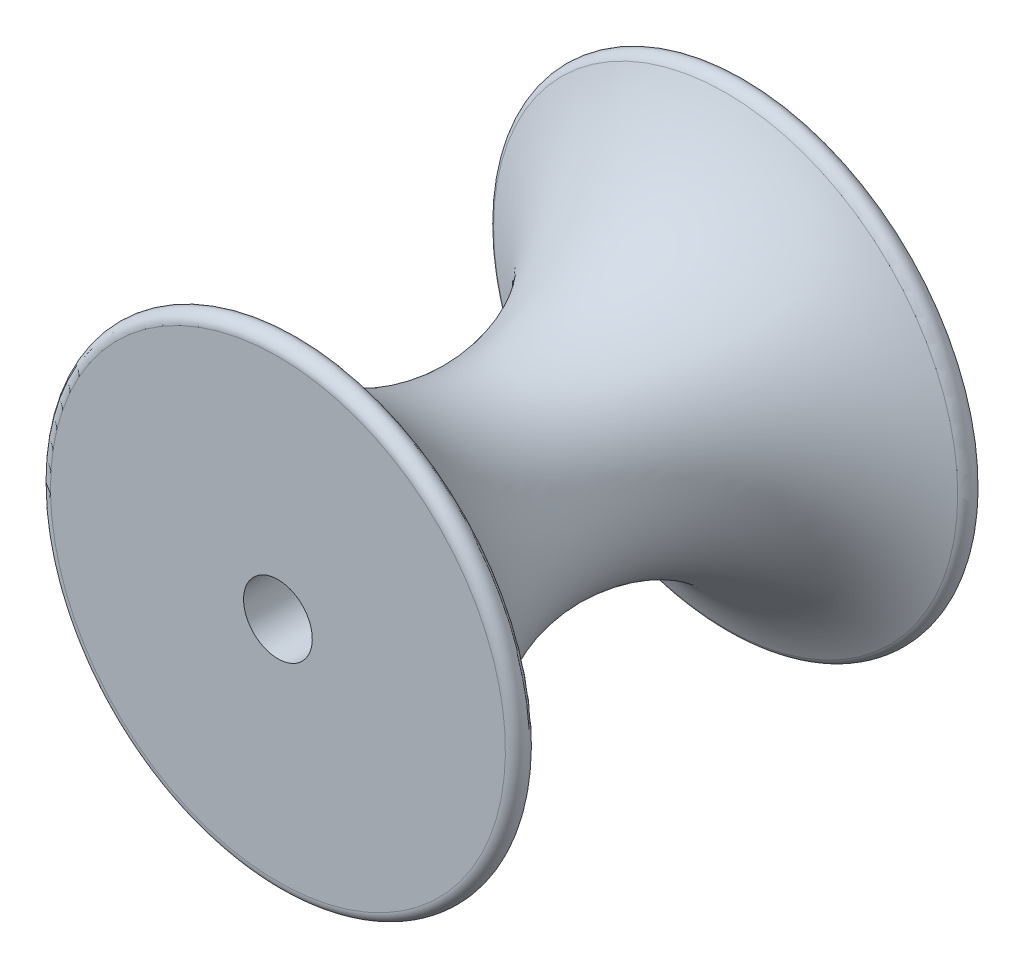
ISO-10303-21;
HEADER;
FILE_DESCRIPTION(('STEP AP214'),'2;1');
FILE_NAME('part.step','',(''),(''),'','','');
FILE_SCHEMA(('AUTOMOTIVE_DESIGN { 1 0 10303 214 1 1 1 1 }'));
ENDSEC;
DATA;
#1=APPLICATION_CONTEXT('core data for automotive mechanical design processes');
#2=APPLICATION_PROTOCOL_DEFINITION('international standard','automotive_design',2000,#1);
#3=PRODUCT_CONTEXT('',#1,'mechanical');
#4=PRODUCT('Part','Part','',(#3));
#5=PRODUCT_RELATED_PRODUCT_CATEGORY('part','',(#4));
#6=PRODUCT_DEFINITION_FORMATION('','',#4);
#7=PRODUCT_DEFINITION_CONTEXT('part definition',#1,'design');
#8=PRODUCT_DEFINITION('design','',#6,#7);
#9=PRODUCT_DEFINITION_SHAPE('','',#8);
#10=(LENGTH_UNIT() NAMED_UNIT(*) SI_UNIT(.MILLI.,.METRE.));
#11=(NAMED_UNIT(*) PLANE_ANGLE_UNIT() SI_UNIT($,.RADIAN.));
#12=(NAMED_UNIT(*) SI_UNIT($,.STERADIAN.) SOLID_ANGLE_UNIT());
#13=UNCERTAINTY_MEASURE_WITH_UNIT(LENGTH_MEASURE(1.E-05),#10,'distance_accuracy_value','');
#14=(GEOMETRIC_REPRESENTATION_CONTEXT(3) GLOBAL_UNCERTAINTY_ASSIGNED_CONTEXT((#13)) GLOBAL_UNIT_ASSIGNED_CONTEXT((#10,
#11,#12)) REPRESENTATION_CONTEXT('',''));
#15=CARTESIAN_POINT('',(0.,0.,0.));
#16=DIRECTION('',(0.,0.,1.));
#17=DIRECTION('',(1.,0.,0.));
#18=AXIS2_PLACEMENT_3D('',#15,#16,#17);
#19=CARTESIAN_POINT('',(0.,0.,-10.9));
#20=DIRECTION('',(0.,0.,-1.));
#21=DIRECTION('',(0.,1.,0.));
#22=AXIS2_PLACEMENT_3D('',#19,#20,#21);
#23=PLANE('',#22);
#24=CARTESIAN_POINT('',(0.,0.,-10.9));
#25=DIRECTION('',(0.,0.,-1.));
#26=DIRECTION('',(0.,1.,0.));
#27=AXIS2_PLACEMENT_3D('',#24,#25,#26);
#28=CIRCLE('',#27,10.5918435232768);
#29=CARTESIAN_POINT('',(0.,10.5918435232768,-10.9));
#30=VERTEX_POINT('',#29);
#31=EDGE_CURVE('E10',#30,#30,#28,.T.);
#32=ORIENTED_EDGE('',*,*,#31,.T.);
#33=EDGE_LOOP('',(#32));
#34=FACE_BOUND('',#33,.T.);
#35=CARTESIAN_POINT('',(0.,0.,-10.9));
#36=DIRECTION('',(0.,0.,-1.));
#37=DIRECTION('',(0.,1.,0.));
#38=AXIS2_PLACEMENT_3D('',#35,#36,#37);
#39=CIRCLE('',#38,1.60000000000001);
#40=CARTESIAN_POINT('',(0.,1.60000000000001,-10.9));
#41=VERTEX_POINT('',#40);
#42=EDGE_CURVE('E62',#41,#41,#39,.T.);
#43=ORIENTED_EDGE('',*,*,#42,.F.);
#44=EDGE_LOOP('',(#43));
#45=FACE_BOUND('',#44,.T.);
#46=ADVANCED_FACE('F39',(#34,#45),#23,.T.);
#47=CARTESIAN_POINT('',(0.,0.,0.));
#48=DIRECTION('',(0.,0.,-1.));
#49=DIRECTION('',(0.,1.,0.));
#50=AXIS2_PLACEMENT_3D('',#47,#48,#49);
#51=TOROIDAL_SURFACE('',#50,15.5,11.);
#52=CARTESIAN_POINT('',(0.,0.,9.94782608695652));
#53=DIRECTION('',(0.,0.,-1.));
#54=DIRECTION('',(0.,1.,0.));
#55=AXIS2_PLACEMENT_3D('',#52,#53,#54);
#56=CIRCLE('',#55,10.8052416309604);
#57=CARTESIAN_POINT('',(0.,10.8052416309604,9.94782608695652));
#58=VERTEX_POINT('',#57);
#59=EDGE_CURVE('E50',#58,#58,#56,.T.);
#60=ORIENTED_EDGE('',*,*,#59,.T.);
#61=EDGE_LOOP('',(#60));
#62=FACE_BOUND('',#61,.T.);
#63=CARTESIAN_POINT('',(0.,0.,-9.94782608695651));
#64=DIRECTION('',(0.,0.,1.));
#65=DIRECTION('',(0.,-1.,0.));
#66=AXIS2_PLACEMENT_3D('',#63,#64,#65);
#67=CIRCLE('',#66,10.8052416309604);
#68=CARTESIAN_POINT('',(0.,-10.8052416309604,-9.94782608695652));
#69=VERTEX_POINT('',#68);
#70=EDGE_CURVE('E54',#69,#69,#67,.T.);
#71=ORIENTED_EDGE('',*,*,#70,.T.);
#72=EDGE_LOOP('',(#71));
#73=FACE_BOUND('',#72,.T.);
#74=ADVANCED_FACE('F69',(#62,#73),#51,.F.);
#75=CARTESIAN_POINT('',(0.,0.,10.9));
#76=DIRECTION('',(0.,0.,-1.));
#77=DIRECTION('',(0.,1.,0.));
#78=AXIS2_PLACEMENT_3D('',#75,#76,#77);
#79=PLANE('',#78);
#80=CARTESIAN_POINT('',(0.,0.,10.9));
#81=DIRECTION('',(0.,0.,-1.));
#82=DIRECTION('',(0.,1.,0.));
#83=AXIS2_PLACEMENT_3D('',#80,#81,#82);
#84=CIRCLE('',#83,10.5918435232768);
#85=CARTESIAN_POINT('',(0.,10.5918435232768,10.9));
#86=VERTEX_POINT('',#85);
#87=EDGE_CURVE('E46',#86,#86,#84,.F.);
#88=ORIENTED_EDGE('',*,*,#87,.T.);
#89=EDGE_LOOP('',(#88));
#90=FACE_BOUND('',#89,.T.);
#91=CARTESIAN_POINT('',(0.,0.,10.9));
#92=DIRECTION('',(0.,0.,-1.));
#93=DIRECTION('',(0.,1.,0.));
#94=AXIS2_PLACEMENT_3D('',#91,#92,#93);
#95=CIRCLE('',#94,1.60000000000001);
#96=CARTESIAN_POINT('',(0.,1.6,10.9));
#97=VERTEX_POINT('',#96);
#98=EDGE_CURVE('E59',#97,#97,#95,.T.);
#99=ORIENTED_EDGE('',*,*,#98,.T.);
#100=EDGE_LOOP('',(#99));
#101=FACE_BOUND('',#100,.T.);
#102=ADVANCED_FACE('F75',(#90,#101),#79,.F.);
#103=CARTESIAN_POINT('',(0.,0.,-11.));
#104=DIRECTION('',(0.,0.,-1.));
#105=DIRECTION('',(0.,1.,0.));
#106=AXIS2_PLACEMENT_3D('',#103,#104,#105);
#107=CYLINDRICAL_SURFACE('',#106,1.60000000000001);
#108=ORIENTED_EDGE('',*,*,#98,.F.);
#109=EDGE_LOOP('',(#108));
#110=FACE_BOUND('',#109,.T.);
#111=ORIENTED_EDGE('',*,*,#42,.T.);
#112=EDGE_LOOP('',(#111));
#113=FACE_BOUND('',#112,.T.);
#114=ADVANCED_FACE('F66',(#110,#113),#107,.F.);
#115=CARTESIAN_POINT('',(0.,0.,10.4));
#116=DIRECTION('',(0.,0.,1.));
#117=DIRECTION('',(0.,-1.,0.));
#118=AXIS2_PLACEMENT_3D('',#115,#116,#117);
#119=TOROIDAL_SURFACE('',#118,10.5918435232768,0.5);
#120=ORIENTED_EDGE('',*,*,#87,.F.);
#121=EDGE_LOOP('',(#120));
#122=FACE_BOUND('',#121,.T.);
#123=ORIENTED_EDGE('',*,*,#59,.F.);
#124=EDGE_LOOP('',(#123));
#125=FACE_BOUND('',#124,.T.);
#126=ADVANCED_FACE('F79',(#122,#125),#119,.T.);
#127=CARTESIAN_POINT('',(0.,0.,-10.4));
#128=DIRECTION('',(0.,0.,1.));
#129=DIRECTION('',(0.,-1.,0.));
#130=AXIS2_PLACEMENT_3D('',#127,#128,#129);
#131=TOROIDAL_SURFACE('',#130,10.5918435232768,0.5);
#132=ORIENTED_EDGE('',*,*,#70,.F.);
#133=EDGE_LOOP('',(#132));
#134=FACE_BOUND('',#133,.T.);
#135=ORIENTED_EDGE('',*,*,#31,.F.);
#136=EDGE_LOOP('',(#135));
#137=FACE_BOUND('',#136,.T.);
#138=ADVANCED_FACE('F41',(#134,#137),#131,.T.);
#139=CLOSED_SHELL('',(#46,#74,#102,#114,#126,#138));
#140=MANIFOLD_SOLID_BREP('B2',#139);
#141=ADVANCED_BREP_SHAPE_REPRESENTATION('',(#18,#140),#14);
#142=SHAPE_DEFINITION_REPRESENTATION(#9,#141);
ENDSEC;
END-ISO-10303-21;
